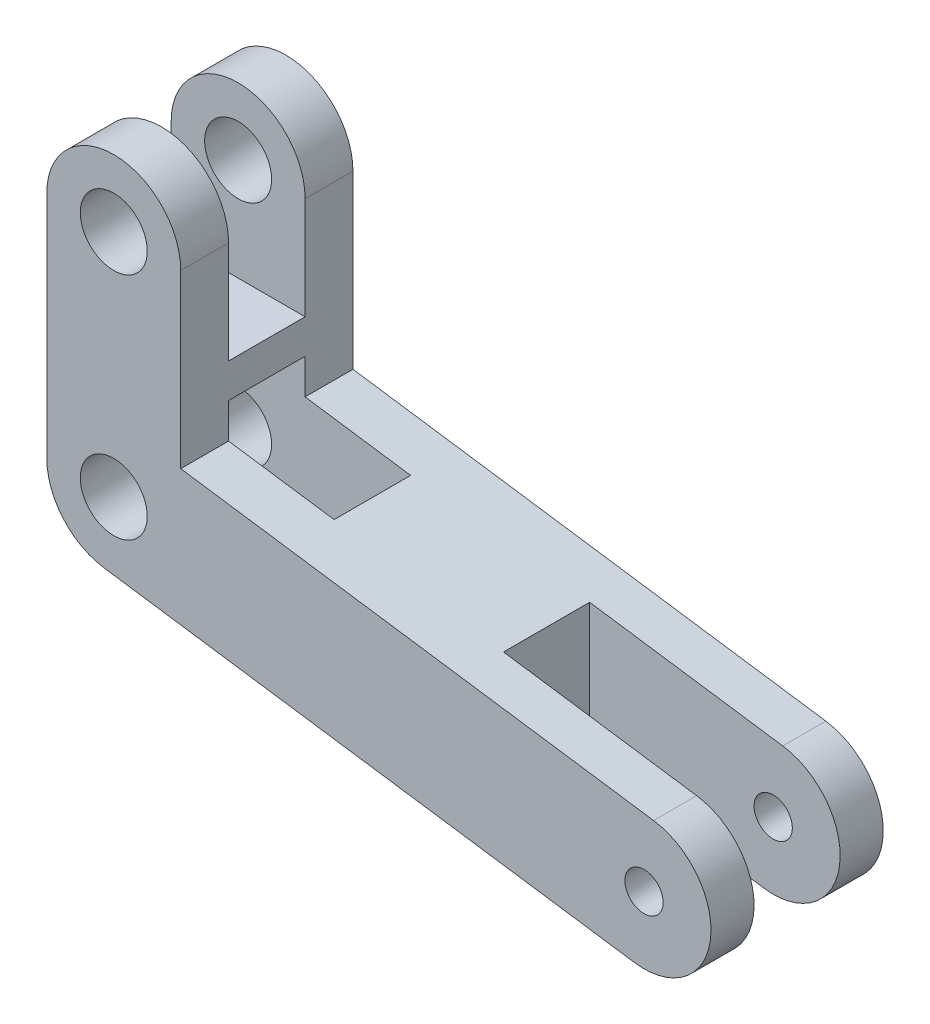
ISO-10303-21;
HEADER;
FILE_DESCRIPTION(('STEP AP214'),'2;1');
FILE_NAME('part.step','',(''),(''),'','','');
FILE_SCHEMA(('AUTOMOTIVE_DESIGN { 1 0 10303 214 1 1 1 1 }'));
ENDSEC;
DATA;
#1=APPLICATION_CONTEXT('core data for automotive mechanical design processes');
#2=APPLICATION_PROTOCOL_DEFINITION('international standard','automotive_design',2000,#1);
#3=PRODUCT_CONTEXT('',#1,'mechanical');
#4=PRODUCT('Part','Part','',(#3));
#5=PRODUCT_RELATED_PRODUCT_CATEGORY('part','',(#4));
#6=PRODUCT_DEFINITION_FORMATION('','',#4);
#7=PRODUCT_DEFINITION_CONTEXT('part definition',#1,'design');
#8=PRODUCT_DEFINITION('design','',#6,#7);
#9=PRODUCT_DEFINITION_SHAPE('','',#8);
#10=(LENGTH_UNIT() NAMED_UNIT(*) SI_UNIT(.MILLI.,.METRE.));
#11=(NAMED_UNIT(*) PLANE_ANGLE_UNIT() SI_UNIT($,.RADIAN.));
#12=(NAMED_UNIT(*) SI_UNIT($,.STERADIAN.) SOLID_ANGLE_UNIT());
#13=UNCERTAINTY_MEASURE_WITH_UNIT(LENGTH_MEASURE(1.E-05),#10,'distance_accuracy_value','');
#14=(GEOMETRIC_REPRESENTATION_CONTEXT(3) GLOBAL_UNCERTAINTY_ASSIGNED_CONTEXT((#13)) GLOBAL_UNIT_ASSIGNED_CONTEXT((#10,
#11,#12)) REPRESENTATION_CONTEXT('',''));
#15=CARTESIAN_POINT('',(0.,0.,0.));
#16=DIRECTION('',(0.,0.,1.));
#17=DIRECTION('',(1.,0.,0.));
#18=AXIS2_PLACEMENT_3D('',#15,#16,#17);
#19=CARTESIAN_POINT('',(27.712812921102,-4.,4.5));
#20=DIRECTION('',(0.,0.,-1.));
#21=DIRECTION('',(-1.,0.,0.));
#22=AXIS2_PLACEMENT_3D('',#19,#20,#21);
#23=CYLINDRICAL_SURFACE('',#22,3.5);
#24=CARTESIAN_POINT('',(27.712812921102,-4.,-2.25));
#25=DIRECTION('',(0.,0.,1.));
#26=DIRECTION('',(1.,0.,0.));
#27=AXIS2_PLACEMENT_3D('',#24,#25,#26);
#28=CIRCLE('',#27,3.5);
#29=CARTESIAN_POINT('',(27.212812921102,-7.46410161513776,-2.25));
#30=VERTEX_POINT('',#29);
#31=CARTESIAN_POINT('',(28.212812921102,-0.535898384862245,-2.25));
#32=VERTEX_POINT('',#31);
#33=EDGE_CURVE('E219',#30,#32,#28,.T.);
#34=ORIENTED_EDGE('',*,*,#33,.F.);
#35=DIRECTION('',(0.,0.,-1.));
#36=VECTOR('',#35,1.);
#37=CARTESIAN_POINT('',(27.212812921102,-7.46410161513776,4.5));
#38=LINE('',#37,#36);
#39=CARTESIAN_POINT('',(27.212812921102,-7.46410161513776,-4.5));
#40=VERTEX_POINT('',#39);
#41=EDGE_CURVE('E323',#30,#40,#38,.T.);
#42=ORIENTED_EDGE('',*,*,#41,.T.);
#43=CARTESIAN_POINT('',(27.712812921102,-4.,-4.5));
#44=DIRECTION('',(0.,0.,1.));
#45=DIRECTION('',(1.,0.,0.));
#46=AXIS2_PLACEMENT_3D('',#43,#44,#45);
#47=CIRCLE('',#46,3.5);
#48=CARTESIAN_POINT('',(28.212812921102,-0.535898384862245,-4.5));
#49=VERTEX_POINT('',#48);
#50=EDGE_CURVE('E304',#40,#49,#47,.T.);
#51=ORIENTED_EDGE('',*,*,#50,.T.);
#52=DIRECTION('',(0.,0.,-1.));
#53=VECTOR('',#52,1.);
#54=CARTESIAN_POINT('',(28.212812921102,-0.535898384862245,4.5));
#55=LINE('',#54,#53);
#56=EDGE_CURVE('E366',#32,#49,#55,.T.);
#57=ORIENTED_EDGE('',*,*,#56,.F.);
#58=EDGE_LOOP('',(#34,#42,#51,#57));
#59=FACE_BOUND('',#58,.T.);
#60=ADVANCED_FACE('F41',(#59),#23,.T.);
#61=CARTESIAN_POINT('',(28.212812921102,-0.535898384862245,4.5));
#62=DIRECTION('',(-0.142857142857143,-0.989743318610787,0.));
#63=DIRECTION('',(0.989743318610787,-0.142857142857143,0.));
#64=AXIS2_PLACEMENT_3D('',#61,#62,#63);
#65=PLANE('',#64);
#66=DIRECTION('',(-0.989743318610787,0.142857142857143,0.));
#67=VECTOR('',#66,1.);
#68=CARTESIAN_POINT('',(28.212812921102,-0.535898384862245,-2.25));
#69=LINE('',#68,#67);
#70=CARTESIAN_POINT('',(18.1194036640366,0.920959753039698,-2.25));
#71=VERTEX_POINT('',#70);
#72=EDGE_CURVE('E201',#32,#71,#69,.T.);
#73=ORIENTED_EDGE('',*,*,#72,.F.);
#74=ORIENTED_EDGE('',*,*,#56,.T.);
#75=DIRECTION('',(-0.989743318610787,0.142857142857143,0.));
#76=VECTOR('',#75,1.);
#77=CARTESIAN_POINT('',(28.212812921102,-0.535898384862245,-4.5));
#78=LINE('',#77,#76);
#79=CARTESIAN_POINT('',(3.5,3.03108891324554,-4.5));
#80=VERTEX_POINT('',#79);
#81=EDGE_CURVE('E326',#49,#80,#78,.T.);
#82=ORIENTED_EDGE('',*,*,#81,.T.);
#83=DIRECTION('',(0.,0.,-1.));
#84=VECTOR('',#83,1.);
#85=CARTESIAN_POINT('',(3.5,3.03108891324554,4.5));
#86=LINE('',#85,#84);
#87=CARTESIAN_POINT('',(3.5,3.03108891324554,-2.));
#88=VERTEX_POINT('',#87);
#89=EDGE_CURVE('E362',#88,#80,#86,.T.);
#90=ORIENTED_EDGE('',*,*,#89,.F.);
#91=DIRECTION('',(0.989743318610787,-0.142857142857143,0.));
#92=VECTOR('',#91,1.);
#93=CARTESIAN_POINT('',(28.212812921102,-0.535898384862245,-2.));
#94=LINE('',#93,#92);
#95=CARTESIAN_POINT('',(9.01483292771079,2.23509134440813,-2.));
#96=VERTEX_POINT('',#95);
#97=EDGE_CURVE('E279',#88,#96,#94,.T.);
#98=ORIENTED_EDGE('',*,*,#97,.T.);
#99=DIRECTION('',(0.,0.,1.));
#100=VECTOR('',#99,1.);
#101=CARTESIAN_POINT('',(9.01483292771079,2.23509134440813,4.5));
#102=LINE('',#101,#100);
#103=CARTESIAN_POINT('',(9.01483292771079,2.23509134440813,2.));
#104=VERTEX_POINT('',#103);
#105=EDGE_CURVE('E282',#96,#104,#102,.T.);
#106=ORIENTED_EDGE('',*,*,#105,.T.);
#107=DIRECTION('',(0.989743318610787,-0.142857142857143,0.));
#108=VECTOR('',#107,1.);
#109=CARTESIAN_POINT('',(28.212812921102,-0.535898384862245,2.));
#110=LINE('',#109,#108);
#111=CARTESIAN_POINT('',(3.5,3.03108891324554,2.));
#112=VERTEX_POINT('',#111);
#113=EDGE_CURVE('E264',#112,#104,#110,.T.);
#114=ORIENTED_EDGE('',*,*,#113,.F.);
#115=CARTESIAN_POINT('',(3.5,3.03108891324554,4.5));
#116=VERTEX_POINT('',#115);
#117=EDGE_CURVE('E363',#116,#112,#86,.T.);
#118=ORIENTED_EDGE('',*,*,#117,.F.);
#119=DIRECTION('',(-0.989743318610787,0.142857142857143,0.));
#120=VECTOR('',#119,1.);
#121=CARTESIAN_POINT('',(28.212812921102,-0.535898384862245,4.5));
#122=LINE('',#121,#120);
#123=CARTESIAN_POINT('',(28.212812921102,-0.535898384862245,4.5));
#124=VERTEX_POINT('',#123);
#125=EDGE_CURVE('E310',#124,#116,#122,.T.);
#126=ORIENTED_EDGE('',*,*,#125,.F.);
#127=CARTESIAN_POINT('',(28.212812921102,-0.535898384862245,2.25));
#128=VERTEX_POINT('',#127);
#129=EDGE_CURVE('E210',#124,#128,#55,.T.);
#130=ORIENTED_EDGE('',*,*,#129,.T.);
#131=DIRECTION('',(-0.989743318610787,0.142857142857143,0.));
#132=VECTOR('',#131,1.);
#133=CARTESIAN_POINT('',(28.212812921102,-0.535898384862245,2.25));
#134=LINE('',#133,#132);
#135=CARTESIAN_POINT('',(18.1194036640366,0.920959753039698,2.25));
#136=VERTEX_POINT('',#135);
#137=EDGE_CURVE('E204',#128,#136,#134,.T.);
#138=ORIENTED_EDGE('',*,*,#137,.T.);
#139=DIRECTION('',(0.,0.,-1.));
#140=VECTOR('',#139,1.);
#141=CARTESIAN_POINT('',(18.1194036640366,0.920959753039699,4.5));
#142=LINE('',#141,#140);
#143=EDGE_CURVE('E191',#136,#71,#142,.T.);
#144=ORIENTED_EDGE('',*,*,#143,.T.);
#145=EDGE_LOOP('',(#73,#74,#82,#90,#98,#106,#114,#118,#126,#130,#138,#144));
#146=FACE_BOUND('',#145,.T.);
#147=ADVANCED_FACE('F208',(#146),#65,.F.);
#148=CARTESIAN_POINT('',(27.212812921102,-7.46410161513776,4.5));
#149=DIRECTION('',(0.142857142857143,0.989743318610787,0.));
#150=DIRECTION('',(-0.989743318610787,0.142857142857143,0.));
#151=AXIS2_PLACEMENT_3D('',#148,#149,#150);
#152=PLANE('',#151);
#153=DIRECTION('',(0.989743318610787,-0.142857142857143,0.));
#154=VECTOR('',#153,1.);
#155=CARTESIAN_POINT('',(27.212812921102,-7.46410161513776,-2.25));
#156=LINE('',#155,#154);
#157=CARTESIAN_POINT('',(18.1194036640366,-6.15158104453322,-2.25));
#158=VERTEX_POINT('',#157);
#159=EDGE_CURVE('E214',#158,#30,#156,.T.);
#160=ORIENTED_EDGE('',*,*,#159,.F.);
#161=DIRECTION('',(0.,0.,1.));
#162=VECTOR('',#161,1.);
#163=CARTESIAN_POINT('',(18.1194036640366,-6.15158104453322,4.5));
#164=LINE('',#163,#162);
#165=CARTESIAN_POINT('',(18.1194036640366,-6.15158104453322,2.25));
#166=VERTEX_POINT('',#165);
#167=EDGE_CURVE('E11',#158,#166,#164,.T.);
#168=ORIENTED_EDGE('',*,*,#167,.T.);
#169=DIRECTION('',(0.989743318610787,-0.142857142857143,0.));
#170=VECTOR('',#169,1.);
#171=CARTESIAN_POINT('',(27.212812921102,-7.46410161513776,2.25));
#172=LINE('',#171,#170);
#173=CARTESIAN_POINT('',(27.212812921102,-7.46410161513776,2.25));
#174=VERTEX_POINT('',#173);
#175=EDGE_CURVE('E205',#166,#174,#172,.T.);
#176=ORIENTED_EDGE('',*,*,#175,.T.);
#177=CARTESIAN_POINT('',(27.212812921102,-7.46410161513776,4.5));
#178=VERTEX_POINT('',#177);
#179=EDGE_CURVE('E343',#178,#174,#38,.T.);
#180=ORIENTED_EDGE('',*,*,#179,.F.);
#181=DIRECTION('',(0.989743318610787,-0.142857142857143,0.));
#182=VECTOR('',#181,1.);
#183=CARTESIAN_POINT('',(27.212812921102,-7.46410161513776,4.5));
#184=LINE('',#183,#182);
#185=CARTESIAN_POINT('',(-0.5,-3.46410161513775,4.5));
#186=VERTEX_POINT('',#185);
#187=EDGE_CURVE('E321',#186,#178,#184,.T.);
#188=ORIENTED_EDGE('',*,*,#187,.F.);
#189=DIRECTION('',(0.,0.,-1.));
#190=VECTOR('',#189,1.);
#191=CARTESIAN_POINT('',(-0.5,-3.46410161513775,4.5));
#192=LINE('',#191,#190);
#193=CARTESIAN_POINT('',(-0.5,-3.46410161513775,2.));
#194=VERTEX_POINT('',#193);
#195=EDGE_CURVE('E347',#186,#194,#192,.T.);
#196=ORIENTED_EDGE('',*,*,#195,.T.);
#197=DIRECTION('',(-0.989743318610787,0.142857142857143,0.));
#198=VECTOR('',#197,1.);
#199=CARTESIAN_POINT('',(27.212812921102,-7.46410161513776,2.));
#200=LINE('',#199,#198);
#201=CARTESIAN_POINT('',(9.01483292771079,-4.83744945316479,2.));
#202=VERTEX_POINT('',#201);
#203=EDGE_CURVE('E256',#202,#194,#200,.T.);
#204=ORIENTED_EDGE('',*,*,#203,.F.);
#205=DIRECTION('',(0.,0.,-1.));
#206=VECTOR('',#205,1.);
#207=CARTESIAN_POINT('',(9.01483292771079,-4.83744945316479,4.5));
#208=LINE('',#207,#206);
#209=CARTESIAN_POINT('',(9.01483292771079,-4.83744945316479,-2.));
#210=VERTEX_POINT('',#209);
#211=EDGE_CURVE('E368',#202,#210,#208,.T.);
#212=ORIENTED_EDGE('',*,*,#211,.T.);
#213=DIRECTION('',(-0.989743318610787,0.142857142857143,0.));
#214=VECTOR('',#213,1.);
#215=CARTESIAN_POINT('',(27.212812921102,-7.46410161513776,-2.));
#216=LINE('',#215,#214);
#217=CARTESIAN_POINT('',(-0.5,-3.46410161513775,-2.));
#218=VERTEX_POINT('',#217);
#219=EDGE_CURVE('E267',#210,#218,#216,.T.);
#220=ORIENTED_EDGE('',*,*,#219,.T.);
#221=CARTESIAN_POINT('',(-0.5,-3.46410161513775,-4.5));
#222=VERTEX_POINT('',#221);
#223=EDGE_CURVE('E346',#218,#222,#192,.T.);
#224=ORIENTED_EDGE('',*,*,#223,.T.);
#225=DIRECTION('',(0.989743318610787,-0.142857142857143,0.));
#226=VECTOR('',#225,1.);
#227=CARTESIAN_POINT('',(27.212812921102,-7.46410161513776,-4.5));
#228=LINE('',#227,#226);
#229=EDGE_CURVE('E311',#222,#40,#228,.T.);
#230=ORIENTED_EDGE('',*,*,#229,.T.);
#231=ORIENTED_EDGE('',*,*,#41,.F.);
#232=EDGE_LOOP('',(#160,#168,#176,#180,#188,#196,#204,#212,#220,#224,#230,#231));
#233=FACE_BOUND('',#232,.T.);
#234=ADVANCED_FACE('F395',(#233),#152,.F.);
#235=CARTESIAN_POINT('',(27.712812921102,-4.,4.5));
#236=DIRECTION('',(0.,0.,-1.));
#237=DIRECTION('',(-1.,0.,0.));
#238=AXIS2_PLACEMENT_3D('',#235,#236,#237);
#239=CYLINDRICAL_SURFACE('',#238,0.999999999999998);
#240=CARTESIAN_POINT('',(27.712812921102,-4.,-4.5));
#241=DIRECTION('',(0.,0.,1.));
#242=DIRECTION('',(1.,0.,0.));
#243=AXIS2_PLACEMENT_3D('',#240,#241,#242);
#244=CIRCLE('',#243,0.999999999999998);
#245=CARTESIAN_POINT('',(28.712812921102,-4.,-4.5));
#246=VERTEX_POINT('',#245);
#247=EDGE_CURVE('E292',#246,#246,#244,.T.);
#248=ORIENTED_EDGE('',*,*,#247,.F.);
#249=EDGE_LOOP('',(#248));
#250=FACE_BOUND('',#249,.T.);
#251=CARTESIAN_POINT('',(27.712812921102,-4.,-2.25));
#252=DIRECTION('',(0.,0.,1.));
#253=DIRECTION('',(1.,0.,0.));
#254=AXIS2_PLACEMENT_3D('',#251,#252,#253);
#255=CIRCLE('',#254,0.999999999999998);
#256=CARTESIAN_POINT('',(28.712812921102,-4.,-2.25));
#257=VERTEX_POINT('',#256);
#258=EDGE_CURVE('E211',#257,#257,#255,.T.);
#259=ORIENTED_EDGE('',*,*,#258,.T.);
#260=EDGE_LOOP('',(#259));
#261=FACE_BOUND('',#260,.T.);
#262=ADVANCED_FACE('F470',(#250,#261),#239,.F.);
#263=CARTESIAN_POINT('',(3.5,12.,4.5));
#264=DIRECTION('',(-1.,0.,0.));
#265=DIRECTION('',(0.,-1.,0.));
#266=AXIS2_PLACEMENT_3D('',#263,#264,#265);
#267=PLANE('',#266);
#268=DIRECTION('',(0.,1.,0.));
#269=VECTOR('',#268,1.);
#270=CARTESIAN_POINT('',(3.5,16.4698635435501,-2.));
#271=LINE('',#270,#269);
#272=CARTESIAN_POINT('',(3.5,6.65669603838257,-2.));
#273=VERTEX_POINT('',#272);
#274=CARTESIAN_POINT('',(3.5,12.,-2.));
#275=VERTEX_POINT('',#274);
#276=EDGE_CURVE('E224',#273,#275,#271,.T.);
#277=ORIENTED_EDGE('',*,*,#276,.F.);
#278=DIRECTION('',(0.,0.,1.));
#279=VECTOR('',#278,1.);
#280=CARTESIAN_POINT('',(3.5,6.65669603838257,-2.));
#281=LINE('',#280,#279);
#282=CARTESIAN_POINT('',(3.5,6.65669603838257,2.));
#283=VERTEX_POINT('',#282);
#284=EDGE_CURVE('E227',#273,#283,#281,.T.);
#285=ORIENTED_EDGE('',*,*,#284,.T.);
#286=DIRECTION('',(0.,1.,0.));
#287=VECTOR('',#286,1.);
#288=CARTESIAN_POINT('',(3.5,16.4698635435501,2.));
#289=LINE('',#288,#287);
#290=CARTESIAN_POINT('',(3.5,12.,2.));
#291=VERTEX_POINT('',#290);
#292=EDGE_CURVE('E225',#283,#291,#289,.T.);
#293=ORIENTED_EDGE('',*,*,#292,.T.);
#294=DIRECTION('',(0.,0.,-1.));
#295=VECTOR('',#294,1.);
#296=CARTESIAN_POINT('',(3.5,12.,4.5));
#297=LINE('',#296,#295);
#298=CARTESIAN_POINT('',(3.5,12.,4.5));
#299=VERTEX_POINT('',#298);
#300=EDGE_CURVE('E359',#299,#291,#297,.T.);
#301=ORIENTED_EDGE('',*,*,#300,.F.);
#302=DIRECTION('',(0.,1.,0.));
#303=VECTOR('',#302,1.);
#304=CARTESIAN_POINT('',(3.5,12.,4.5));
#305=LINE('',#304,#303);
#306=EDGE_CURVE('E313',#116,#299,#305,.T.);
#307=ORIENTED_EDGE('',*,*,#306,.F.);
#308=ORIENTED_EDGE('',*,*,#117,.T.);
#309=DIRECTION('',(0.,-1.,0.));
#310=VECTOR('',#309,1.);
#311=CARTESIAN_POINT('',(3.5,12.,2.));
#312=LINE('',#311,#310);
#313=CARTESIAN_POINT('',(3.5,4.86934920884361,2.));
#314=VERTEX_POINT('',#313);
#315=EDGE_CURVE('E262',#314,#112,#312,.T.);
#316=ORIENTED_EDGE('',*,*,#315,.F.);
#317=DIRECTION('',(0.,0.,-1.));
#318=VECTOR('',#317,1.);
#319=CARTESIAN_POINT('',(3.5,4.86934920884361,4.5));
#320=LINE('',#319,#318);
#321=CARTESIAN_POINT('',(3.5,4.86934920884361,-2.));
#322=VERTEX_POINT('',#321);
#323=EDGE_CURVE('E285',#314,#322,#320,.T.);
#324=ORIENTED_EDGE('',*,*,#323,.T.);
#325=DIRECTION('',(0.,-1.,0.));
#326=VECTOR('',#325,1.);
#327=CARTESIAN_POINT('',(3.5,12.,-2.));
#328=LINE('',#327,#326);
#329=EDGE_CURVE('E276',#322,#88,#328,.T.);
#330=ORIENTED_EDGE('',*,*,#329,.T.);
#331=ORIENTED_EDGE('',*,*,#89,.T.);
#332=DIRECTION('',(0.,1.,0.));
#333=VECTOR('',#332,1.);
#334=CARTESIAN_POINT('',(3.5,12.,-4.5));
#335=LINE('',#334,#333);
#336=CARTESIAN_POINT('',(3.5,12.,-4.5));
#337=VERTEX_POINT('',#336);
#338=EDGE_CURVE('E329',#80,#337,#335,.T.);
#339=ORIENTED_EDGE('',*,*,#338,.T.);
#340=EDGE_CURVE('E358',#275,#337,#297,.T.);
#341=ORIENTED_EDGE('',*,*,#340,.F.);
#342=EDGE_LOOP('',(#277,#285,#293,#301,#307,#308,#316,#324,#330,#331,#339,#341));
#343=FACE_BOUND('',#342,.T.);
#344=ADVANCED_FACE('F411',(#343),#267,.F.);
#345=CARTESIAN_POINT('',(0.,12.,4.5));
#346=DIRECTION('',(0.,0.,-1.));
#347=DIRECTION('',(-1.,0.,0.));
#348=AXIS2_PLACEMENT_3D('',#345,#346,#347);
#349=CYLINDRICAL_SURFACE('',#348,3.5);
#350=CARTESIAN_POINT('',(0.,12.,-2.));
#351=DIRECTION('',(0.,0.,1.));
#352=DIRECTION('',(1.,0.,0.));
#353=AXIS2_PLACEMENT_3D('',#350,#351,#352);
#354=CIRCLE('',#353,3.5);
#355=CARTESIAN_POINT('',(-3.5,12.,-2.));
#356=VERTEX_POINT('',#355);
#357=EDGE_CURVE('E253',#275,#356,#354,.T.);
#358=ORIENTED_EDGE('',*,*,#357,.F.);
#359=ORIENTED_EDGE('',*,*,#340,.T.);
#360=CARTESIAN_POINT('',(0.,12.,-4.5));
#361=DIRECTION('',(0.,0.,1.));
#362=DIRECTION('',(1.,0.,0.));
#363=AXIS2_PLACEMENT_3D('',#360,#361,#362);
#364=CIRCLE('',#363,3.5);
#365=CARTESIAN_POINT('',(-3.5,12.,-4.5));
#366=VERTEX_POINT('',#365);
#367=EDGE_CURVE('E332',#337,#366,#364,.T.);
#368=ORIENTED_EDGE('',*,*,#367,.T.);
#369=DIRECTION('',(0.,0.,-1.));
#370=VECTOR('',#369,1.);
#371=CARTESIAN_POINT('',(-3.5,12.,4.5));
#372=LINE('',#371,#370);
#373=EDGE_CURVE('E354',#356,#366,#372,.T.);
#374=ORIENTED_EDGE('',*,*,#373,.F.);
#375=EDGE_LOOP('',(#358,#359,#368,#374));
#376=FACE_BOUND('',#375,.T.);
#377=ADVANCED_FACE('F459',(#376),#349,.T.);
#378=CARTESIAN_POINT('',(-3.5,12.,4.5));
#379=DIRECTION('',(1.,0.,0.));
#380=DIRECTION('',(0.,1.,0.));
#381=AXIS2_PLACEMENT_3D('',#378,#379,#380);
#382=PLANE('',#381);
#383=DIRECTION('',(0.,-1.,0.));
#384=VECTOR('',#383,1.);
#385=CARTESIAN_POINT('',(-3.5,12.,-2.));
#386=LINE('',#385,#384);
#387=CARTESIAN_POINT('',(-3.5,6.65669603838257,-2.));
#388=VERTEX_POINT('',#387);
#389=EDGE_CURVE('E251',#356,#388,#386,.T.);
#390=ORIENTED_EDGE('',*,*,#389,.F.);
#391=ORIENTED_EDGE('',*,*,#373,.T.);
#392=DIRECTION('',(0.,-1.,0.));
#393=VECTOR('',#392,1.);
#394=CARTESIAN_POINT('',(-3.5,12.,-4.5));
#395=LINE('',#394,#393);
#396=CARTESIAN_POINT('',(-3.5,0.,-4.5));
#397=VERTEX_POINT('',#396);
#398=EDGE_CURVE('E335',#366,#397,#395,.T.);
#399=ORIENTED_EDGE('',*,*,#398,.T.);
#400=DIRECTION('',(0.,0.,-1.));
#401=VECTOR('',#400,1.);
#402=CARTESIAN_POINT('',(-3.5,0.,4.5));
#403=LINE('',#402,#401);
#404=CARTESIAN_POINT('',(-3.5,0.,-2.));
#405=VERTEX_POINT('',#404);
#406=EDGE_CURVE('E350',#405,#397,#403,.T.);
#407=ORIENTED_EDGE('',*,*,#406,.F.);
#408=DIRECTION('',(0.,1.,0.));
#409=VECTOR('',#408,1.);
#410=CARTESIAN_POINT('',(-3.5,12.,-2.));
#411=LINE('',#410,#409);
#412=CARTESIAN_POINT('',(-3.5,4.86934920884361,-2.));
#413=VERTEX_POINT('',#412);
#414=EDGE_CURVE('E273',#405,#413,#411,.T.);
#415=ORIENTED_EDGE('',*,*,#414,.T.);
#416=DIRECTION('',(0.,0.,1.));
#417=VECTOR('',#416,1.);
#418=CARTESIAN_POINT('',(-3.5,4.86934920884361,4.5));
#419=LINE('',#418,#417);
#420=CARTESIAN_POINT('',(-3.5,4.86934920884361,2.));
#421=VERTEX_POINT('',#420);
#422=EDGE_CURVE('E379',#413,#421,#419,.T.);
#423=ORIENTED_EDGE('',*,*,#422,.T.);
#424=DIRECTION('',(0.,1.,0.));
#425=VECTOR('',#424,1.);
#426=CARTESIAN_POINT('',(-3.5,12.,2.));
#427=LINE('',#426,#425);
#428=CARTESIAN_POINT('',(-3.5,0.,2.));
#429=VERTEX_POINT('',#428);
#430=EDGE_CURVE('E260',#429,#421,#427,.T.);
#431=ORIENTED_EDGE('',*,*,#430,.F.);
#432=CARTESIAN_POINT('',(-3.5,0.,4.5));
#433=VERTEX_POINT('',#432);
#434=EDGE_CURVE('E351',#433,#429,#403,.T.);
#435=ORIENTED_EDGE('',*,*,#434,.F.);
#436=DIRECTION('',(0.,-1.,0.));
#437=VECTOR('',#436,1.);
#438=CARTESIAN_POINT('',(-3.5,12.,4.5));
#439=LINE('',#438,#437);
#440=CARTESIAN_POINT('',(-3.5,12.,4.5));
#441=VERTEX_POINT('',#440);
#442=EDGE_CURVE('E317',#441,#433,#439,.T.);
#443=ORIENTED_EDGE('',*,*,#442,.F.);
#444=CARTESIAN_POINT('',(-3.5,12.,2.));
#445=VERTEX_POINT('',#444);
#446=EDGE_CURVE('E355',#441,#445,#372,.T.);
#447=ORIENTED_EDGE('',*,*,#446,.T.);
#448=DIRECTION('',(0.,-1.,0.));
#449=VECTOR('',#448,1.);
#450=CARTESIAN_POINT('',(-3.5,12.,2.));
#451=LINE('',#450,#449);
#452=CARTESIAN_POINT('',(-3.5,6.65669603838257,2.));
#453=VERTEX_POINT('',#452);
#454=EDGE_CURVE('E244',#445,#453,#451,.T.);
#455=ORIENTED_EDGE('',*,*,#454,.T.);
#456=DIRECTION('',(0.,0.,-1.));
#457=VECTOR('',#456,1.);
#458=CARTESIAN_POINT('',(-3.5,6.65669603838257,4.5));
#459=LINE('',#458,#457);
#460=EDGE_CURVE('E49',#453,#388,#459,.T.);
#461=ORIENTED_EDGE('',*,*,#460,.T.);
#462=EDGE_LOOP('',(#390,#391,#399,#407,#415,#423,#431,#435,#443,#447,#455,#461));
#463=FACE_BOUND('',#462,.T.);
#464=ADVANCED_FACE('F434',(#463),#382,.F.);
#465=CARTESIAN_POINT('',(0.,0.,4.5));
#466=DIRECTION('',(0.,0.,-1.));
#467=DIRECTION('',(-1.,0.,0.));
#468=AXIS2_PLACEMENT_3D('',#465,#466,#467);
#469=CYLINDRICAL_SURFACE('',#468,3.5);
#470=CARTESIAN_POINT('',(0.,0.,2.));
#471=DIRECTION('',(0.,0.,-1.));
#472=DIRECTION('',(-1.,0.,0.));
#473=AXIS2_PLACEMENT_3D('',#470,#471,#472);
#474=CIRCLE('',#473,3.5);
#475=EDGE_CURVE('E258',#194,#429,#474,.T.);
#476=ORIENTED_EDGE('',*,*,#475,.F.);
#477=ORIENTED_EDGE('',*,*,#195,.F.);
#478=CARTESIAN_POINT('',(0.,0.,4.5));
#479=DIRECTION('',(0.,0.,1.));
#480=DIRECTION('',(1.,0.,0.));
#481=AXIS2_PLACEMENT_3D('',#478,#479,#480);
#482=CIRCLE('',#481,3.5);
#483=EDGE_CURVE('E319',#433,#186,#482,.T.);
#484=ORIENTED_EDGE('',*,*,#483,.F.);
#485=ORIENTED_EDGE('',*,*,#434,.T.);
#486=EDGE_LOOP('',(#476,#477,#484,#485));
#487=FACE_BOUND('',#486,.T.);
#488=ADVANCED_FACE('F428',(#487),#469,.T.);
#489=CARTESIAN_POINT('',(0.,0.,4.5));
#490=DIRECTION('',(0.,0.,-1.));
#491=DIRECTION('',(-1.,0.,0.));
#492=AXIS2_PLACEMENT_3D('',#489,#490,#491);
#493=CYLINDRICAL_SURFACE('',#492,1.75);
#494=CARTESIAN_POINT('',(0.,0.,4.5));
#495=DIRECTION('',(0.,0.,1.));
#496=DIRECTION('',(1.,0.,0.));
#497=AXIS2_PLACEMENT_3D('',#494,#495,#496);
#498=CIRCLE('',#497,1.75);
#499=CARTESIAN_POINT('',(1.75,0.,4.5));
#500=VERTEX_POINT('',#499);
#501=EDGE_CURVE('E301',#500,#500,#498,.T.);
#502=ORIENTED_EDGE('',*,*,#501,.T.);
#503=EDGE_LOOP('',(#502));
#504=FACE_BOUND('',#503,.T.);
#505=CARTESIAN_POINT('',(0.,0.,2.));
#506=DIRECTION('',(0.,0.,-1.));
#507=DIRECTION('',(-1.,0.,0.));
#508=AXIS2_PLACEMENT_3D('',#505,#506,#507);
#509=CIRCLE('',#508,1.75);
#510=CARTESIAN_POINT('',(-1.75,0.,2.));
#511=VERTEX_POINT('',#510);
#512=EDGE_CURVE('E255',#511,#511,#509,.T.);
#513=ORIENTED_EDGE('',*,*,#512,.T.);
#514=EDGE_LOOP('',(#513));
#515=FACE_BOUND('',#514,.T.);
#516=ADVANCED_FACE('F489',(#504,#515),#493,.F.);
#517=CARTESIAN_POINT('',(0.,12.,4.5));
#518=DIRECTION('',(0.,0.,-1.));
#519=DIRECTION('',(-1.,0.,0.));
#520=AXIS2_PLACEMENT_3D('',#517,#518,#519);
#521=CYLINDRICAL_SURFACE('',#520,1.75);
#522=CARTESIAN_POINT('',(0.,12.,-4.5));
#523=DIRECTION('',(0.,0.,1.));
#524=DIRECTION('',(1.,0.,0.));
#525=AXIS2_PLACEMENT_3D('',#522,#523,#524);
#526=CIRCLE('',#525,1.75);
#527=CARTESIAN_POINT('',(1.75,12.,-4.5));
#528=VERTEX_POINT('',#527);
#529=EDGE_CURVE('E288',#528,#528,#526,.T.);
#530=ORIENTED_EDGE('',*,*,#529,.F.);
#531=EDGE_LOOP('',(#530));
#532=FACE_BOUND('',#531,.T.);
#533=CARTESIAN_POINT('',(0.,12.,-2.));
#534=DIRECTION('',(0.,0.,1.));
#535=DIRECTION('',(1.,0.,0.));
#536=AXIS2_PLACEMENT_3D('',#533,#534,#535);
#537=CIRCLE('',#536,1.75);
#538=CARTESIAN_POINT('',(1.75,12.,-2.));
#539=VERTEX_POINT('',#538);
#540=EDGE_CURVE('E250',#539,#539,#537,.T.);
#541=ORIENTED_EDGE('',*,*,#540,.T.);
#542=EDGE_LOOP('',(#541));
#543=FACE_BOUND('',#542,.T.);
#544=ADVANCED_FACE('F483',(#532,#543),#521,.F.);
#545=CARTESIAN_POINT('',(27.712812921102,-4.,4.5));
#546=DIRECTION('',(0.,0.,1.));
#547=DIRECTION('',(1.,0.,0.));
#548=AXIS2_PLACEMENT_3D('',#545,#546,#547);
#549=PLANE('',#548);
#550=CARTESIAN_POINT('',(27.712812921102,-4.,4.5));
#551=DIRECTION('',(0.,0.,1.));
#552=DIRECTION('',(1.,0.,0.));
#553=AXIS2_PLACEMENT_3D('',#550,#551,#552);
#554=CIRCLE('',#553,0.999999999999998);
#555=CARTESIAN_POINT('',(28.712812921102,-4.,4.5));
#556=VERTEX_POINT('',#555);
#557=EDGE_CURVE('E295',#556,#556,#554,.T.);
#558=ORIENTED_EDGE('',*,*,#557,.F.);
#559=EDGE_LOOP('',(#558));
#560=FACE_BOUND('',#559,.T.);
#561=CARTESIAN_POINT('',(27.712812921102,-4.,4.5));
#562=DIRECTION('',(0.,0.,1.));
#563=DIRECTION('',(1.,0.,0.));
#564=AXIS2_PLACEMENT_3D('',#561,#562,#563);
#565=CIRCLE('',#564,3.5);
#566=EDGE_CURVE('E307',#178,#124,#565,.T.);
#567=ORIENTED_EDGE('',*,*,#566,.T.);
#568=ORIENTED_EDGE('',*,*,#125,.T.);
#569=ORIENTED_EDGE('',*,*,#306,.T.);
#570=CARTESIAN_POINT('',(0.,12.,4.5));
#571=DIRECTION('',(0.,0.,1.));
#572=DIRECTION('',(1.,0.,0.));
#573=AXIS2_PLACEMENT_3D('',#570,#571,#572);
#574=CIRCLE('',#573,3.5);
#575=EDGE_CURVE('E315',#299,#441,#574,.T.);
#576=ORIENTED_EDGE('',*,*,#575,.T.);
#577=ORIENTED_EDGE('',*,*,#442,.T.);
#578=ORIENTED_EDGE('',*,*,#483,.T.);
#579=ORIENTED_EDGE('',*,*,#187,.T.);
#580=EDGE_LOOP('',(#567,#568,#569,#576,#577,#578,#579));
#581=FACE_BOUND('',#580,.T.);
#582=ORIENTED_EDGE('',*,*,#501,.F.);
#583=EDGE_LOOP('',(#582));
#584=FACE_BOUND('',#583,.T.);
#585=CARTESIAN_POINT('',(0.,12.,4.5));
#586=DIRECTION('',(0.,0.,1.));
#587=DIRECTION('',(1.,0.,0.));
#588=AXIS2_PLACEMENT_3D('',#585,#586,#587);
#589=CIRCLE('',#588,1.75);
#590=CARTESIAN_POINT('',(1.75,12.,4.5));
#591=VERTEX_POINT('',#590);
#592=EDGE_CURVE('E289',#591,#591,#589,.T.);
#593=ORIENTED_EDGE('',*,*,#592,.F.);
#594=EDGE_LOOP('',(#593));
#595=FACE_BOUND('',#594,.T.);
#596=ADVANCED_FACE('F443',(#560,#581,#584,#595),#549,.T.);
#597=CARTESIAN_POINT('',(27.712812921102,-4.,-4.5));
#598=DIRECTION('',(0.,0.,1.));
#599=DIRECTION('',(1.,0.,0.));
#600=AXIS2_PLACEMENT_3D('',#597,#598,#599);
#601=PLANE('',#600);
#602=ORIENTED_EDGE('',*,*,#50,.F.);
#603=ORIENTED_EDGE('',*,*,#229,.F.);
#604=CARTESIAN_POINT('',(0.,0.,-4.5));
#605=DIRECTION('',(0.,0.,1.));
#606=DIRECTION('',(1.,0.,0.));
#607=AXIS2_PLACEMENT_3D('',#604,#605,#606);
#608=CIRCLE('',#607,3.5);
#609=EDGE_CURVE('E338',#397,#222,#608,.T.);
#610=ORIENTED_EDGE('',*,*,#609,.F.);
#611=ORIENTED_EDGE('',*,*,#398,.F.);
#612=ORIENTED_EDGE('',*,*,#367,.F.);
#613=ORIENTED_EDGE('',*,*,#338,.F.);
#614=ORIENTED_EDGE('',*,*,#81,.F.);
#615=EDGE_LOOP('',(#602,#603,#610,#611,#612,#613,#614));
#616=FACE_BOUND('',#615,.T.);
#617=CARTESIAN_POINT('',(0.,0.,-4.5));
#618=DIRECTION('',(0.,0.,1.));
#619=DIRECTION('',(1.,0.,0.));
#620=AXIS2_PLACEMENT_3D('',#617,#618,#619);
#621=CIRCLE('',#620,1.75);
#622=CARTESIAN_POINT('',(1.75,0.,-4.5));
#623=VERTEX_POINT('',#622);
#624=EDGE_CURVE('E298',#623,#623,#621,.T.);
#625=ORIENTED_EDGE('',*,*,#624,.T.);
#626=EDGE_LOOP('',(#625));
#627=FACE_BOUND('',#626,.T.);
#628=ORIENTED_EDGE('',*,*,#247,.T.);
#629=EDGE_LOOP('',(#628));
#630=FACE_BOUND('',#629,.T.);
#631=ORIENTED_EDGE('',*,*,#529,.T.);
#632=EDGE_LOOP('',(#631));
#633=FACE_BOUND('',#632,.T.);
#634=ADVANCED_FACE('F404',(#616,#627,#630,#633),#601,.F.);
#635=ORIENTED_EDGE('',*,*,#179,.T.);
#636=CARTESIAN_POINT('',(27.712812921102,-4.,2.25));
#637=DIRECTION('',(0.,0.,1.));
#638=DIRECTION('',(1.,0.,0.));
#639=AXIS2_PLACEMENT_3D('',#636,#637,#638);
#640=CIRCLE('',#639,3.5);
#641=EDGE_CURVE('E56',#174,#128,#640,.T.);
#642=ORIENTED_EDGE('',*,*,#641,.T.);
#643=ORIENTED_EDGE('',*,*,#129,.F.);
#644=ORIENTED_EDGE('',*,*,#566,.F.);
#645=EDGE_LOOP('',(#635,#642,#643,#644));
#646=FACE_BOUND('',#645,.T.);
#647=ADVANCED_FACE('F43',(#646),#23,.T.);
#648=ORIENTED_EDGE('',*,*,#300,.T.);
#649=CARTESIAN_POINT('',(0.,12.,2.));
#650=DIRECTION('',(0.,0.,1.));
#651=DIRECTION('',(1.,0.,0.));
#652=AXIS2_PLACEMENT_3D('',#649,#650,#651);
#653=CIRCLE('',#652,3.5);
#654=EDGE_CURVE('E247',#291,#445,#653,.T.);
#655=ORIENTED_EDGE('',*,*,#654,.T.);
#656=ORIENTED_EDGE('',*,*,#446,.F.);
#657=ORIENTED_EDGE('',*,*,#575,.F.);
#658=EDGE_LOOP('',(#648,#655,#656,#657));
#659=FACE_BOUND('',#658,.T.);
#660=ADVANCED_FACE('F450',(#659),#349,.T.);
#661=ORIENTED_EDGE('',*,*,#223,.F.);
#662=CARTESIAN_POINT('',(0.,0.,-2.));
#663=DIRECTION('',(0.,0.,-1.));
#664=DIRECTION('',(-1.,0.,0.));
#665=AXIS2_PLACEMENT_3D('',#662,#663,#664);
#666=CIRCLE('',#665,3.5);
#667=EDGE_CURVE('E270',#218,#405,#666,.T.);
#668=ORIENTED_EDGE('',*,*,#667,.T.);
#669=ORIENTED_EDGE('',*,*,#406,.T.);
#670=ORIENTED_EDGE('',*,*,#609,.T.);
#671=EDGE_LOOP('',(#661,#668,#669,#670));
#672=FACE_BOUND('',#671,.T.);
#673=ADVANCED_FACE('F456',(#672),#469,.T.);
#674=CARTESIAN_POINT('',(0.,0.,-2.));
#675=DIRECTION('',(0.,0.,-1.));
#676=DIRECTION('',(-1.,0.,0.));
#677=AXIS2_PLACEMENT_3D('',#674,#675,#676);
#678=CIRCLE('',#677,1.75);
#679=CARTESIAN_POINT('',(-1.75,0.,-2.));
#680=VERTEX_POINT('',#679);
#681=EDGE_CURVE('E266',#680,#680,#678,.T.);
#682=ORIENTED_EDGE('',*,*,#681,.F.);
#683=EDGE_LOOP('',(#682));
#684=FACE_BOUND('',#683,.T.);
#685=ORIENTED_EDGE('',*,*,#624,.F.);
#686=EDGE_LOOP('',(#685));
#687=FACE_BOUND('',#686,.T.);
#688=ADVANCED_FACE('F478',(#684,#687),#493,.F.);
#689=CARTESIAN_POINT('',(27.712812921102,-4.,2.25));
#690=DIRECTION('',(0.,0.,1.));
#691=DIRECTION('',(1.,0.,0.));
#692=AXIS2_PLACEMENT_3D('',#689,#690,#691);
#693=CIRCLE('',#692,0.999999999999998);
#694=CARTESIAN_POINT('',(28.712812921102,-4.,2.25));
#695=VERTEX_POINT('',#694);
#696=EDGE_CURVE('E384',#695,#695,#693,.T.);
#697=ORIENTED_EDGE('',*,*,#696,.F.);
#698=EDGE_LOOP('',(#697));
#699=FACE_BOUND('',#698,.T.);
#700=ORIENTED_EDGE('',*,*,#557,.T.);
#701=EDGE_LOOP('',(#700));
#702=FACE_BOUND('',#701,.T.);
#703=ADVANCED_FACE('F487',(#699,#702),#239,.F.);
#704=CARTESIAN_POINT('',(0.,12.,2.));
#705=DIRECTION('',(0.,0.,1.));
#706=DIRECTION('',(1.,0.,0.));
#707=AXIS2_PLACEMENT_3D('',#704,#705,#706);
#708=CIRCLE('',#707,1.75);
#709=CARTESIAN_POINT('',(1.75,12.,2.));
#710=VERTEX_POINT('',#709);
#711=EDGE_CURVE('E235',#710,#710,#708,.T.);
#712=ORIENTED_EDGE('',*,*,#711,.F.);
#713=EDGE_LOOP('',(#712));
#714=FACE_BOUND('',#713,.T.);
#715=ORIENTED_EDGE('',*,*,#592,.T.);
#716=EDGE_LOOP('',(#715));
#717=FACE_BOUND('',#716,.T.);
#718=ADVANCED_FACE('F491',(#714,#717),#521,.F.);
#719=CARTESIAN_POINT('',(-5.69968246198156,6.65669603838257,-2.));
#720=DIRECTION('',(0.,-1.,0.));
#721=DIRECTION('',(0.,0.,-1.));
#722=AXIS2_PLACEMENT_3D('',#719,#720,#721);
#723=PLANE('',#722);
#724=DIRECTION('',(1.,0.,0.));
#725=VECTOR('',#724,1.);
#726=CARTESIAN_POINT('',(-5.69968246198156,6.65669603838257,2.));
#727=LINE('',#726,#725);
#728=EDGE_CURVE('E228',#453,#283,#727,.T.);
#729=ORIENTED_EDGE('',*,*,#728,.T.);
#730=ORIENTED_EDGE('',*,*,#284,.F.);
#731=DIRECTION('',(1.,0.,0.));
#732=VECTOR('',#731,1.);
#733=CARTESIAN_POINT('',(-5.69968246198156,6.65669603838257,-2.));
#734=LINE('',#733,#732);
#735=EDGE_CURVE('E222',#388,#273,#734,.T.);
#736=ORIENTED_EDGE('',*,*,#735,.F.);
#737=ORIENTED_EDGE('',*,*,#460,.F.);
#738=EDGE_LOOP('',(#729,#730,#736,#737));
#739=FACE_BOUND('',#738,.T.);
#740=ADVANCED_FACE('F495',(#739),#723,.F.);
#741=CARTESIAN_POINT('',(0.,0.,-2.));
#742=DIRECTION('',(0.,0.,1.));
#743=DIRECTION('',(1.,0.,0.));
#744=AXIS2_PLACEMENT_3D('',#741,#742,#743);
#745=PLANE('',#744);
#746=ORIENTED_EDGE('',*,*,#540,.F.);
#747=EDGE_LOOP('',(#746));
#748=FACE_BOUND('',#747,.T.);
#749=ORIENTED_EDGE('',*,*,#357,.T.);
#750=ORIENTED_EDGE('',*,*,#389,.T.);
#751=ORIENTED_EDGE('',*,*,#735,.T.);
#752=ORIENTED_EDGE('',*,*,#276,.T.);
#753=EDGE_LOOP('',(#749,#750,#751,#752));
#754=FACE_BOUND('',#753,.T.);
#755=ADVANCED_FACE('F509',(#748,#754),#745,.T.);
#756=CARTESIAN_POINT('',(0.,0.,2.));
#757=DIRECTION('',(0.,0.,1.));
#758=DIRECTION('',(1.,0.,0.));
#759=AXIS2_PLACEMENT_3D('',#756,#757,#758);
#760=PLANE('',#759);
#761=ORIENTED_EDGE('',*,*,#711,.T.);
#762=EDGE_LOOP('',(#761));
#763=FACE_BOUND('',#762,.T.);
#764=ORIENTED_EDGE('',*,*,#292,.F.);
#765=ORIENTED_EDGE('',*,*,#728,.F.);
#766=ORIENTED_EDGE('',*,*,#454,.F.);
#767=ORIENTED_EDGE('',*,*,#654,.F.);
#768=EDGE_LOOP('',(#764,#765,#766,#767));
#769=FACE_BOUND('',#768,.T.);
#770=ADVANCED_FACE('F501',(#763,#769),#760,.F.);
#771=CARTESIAN_POINT('',(-5.64552182951993,4.86934920884361,-2.));
#772=DIRECTION('',(0.,1.,0.));
#773=DIRECTION('',(0.,0.,1.));
#774=AXIS2_PLACEMENT_3D('',#771,#772,#773);
#775=PLANE('',#774);
#776=DIRECTION('',(-1.,0.,0.));
#777=VECTOR('',#776,1.);
#778=CARTESIAN_POINT('',(-5.64552182951993,4.86934920884361,2.));
#779=LINE('',#778,#777);
#780=EDGE_CURVE('E64',#314,#421,#779,.T.);
#781=ORIENTED_EDGE('',*,*,#780,.T.);
#782=ORIENTED_EDGE('',*,*,#422,.F.);
#783=DIRECTION('',(-1.,0.,0.));
#784=VECTOR('',#783,1.);
#785=CARTESIAN_POINT('',(-5.64552182951993,4.86934920884361,-2.));
#786=LINE('',#785,#784);
#787=EDGE_CURVE('E230',#322,#413,#786,.T.);
#788=ORIENTED_EDGE('',*,*,#787,.F.);
#789=ORIENTED_EDGE('',*,*,#323,.F.);
#790=EDGE_LOOP('',(#781,#782,#788,#789));
#791=FACE_BOUND('',#790,.T.);
#792=ADVANCED_FACE('F436',(#791),#775,.F.);
#793=CARTESIAN_POINT('',(9.01483292771079,-5.65610443682518,-2.));
#794=DIRECTION('',(1.,0.,0.));
#795=DIRECTION('',(0.,0.,-1.));
#796=AXIS2_PLACEMENT_3D('',#793,#794,#795);
#797=PLANE('',#796);
#798=DIRECTION('',(0.,1.,0.));
#799=VECTOR('',#798,1.);
#800=CARTESIAN_POINT('',(9.01483292771079,-5.65610443682518,-2.));
#801=LINE('',#800,#799);
#802=EDGE_CURVE('E236',#210,#96,#801,.T.);
#803=ORIENTED_EDGE('',*,*,#802,.F.);
#804=ORIENTED_EDGE('',*,*,#211,.F.);
#805=DIRECTION('',(0.,1.,0.));
#806=VECTOR('',#805,1.);
#807=CARTESIAN_POINT('',(9.01483292771079,-5.65610443682518,2.));
#808=LINE('',#807,#806);
#809=EDGE_CURVE('E200',#202,#104,#808,.T.);
#810=ORIENTED_EDGE('',*,*,#809,.T.);
#811=ORIENTED_EDGE('',*,*,#105,.F.);
#812=EDGE_LOOP('',(#803,#804,#810,#811));
#813=FACE_BOUND('',#812,.T.);
#814=ADVANCED_FACE('F419',(#813),#797,.F.);
#815=CARTESIAN_POINT('',(0.,0.,-2.));
#816=DIRECTION('',(0.,0.,-1.));
#817=DIRECTION('',(-1.,0.,0.));
#818=AXIS2_PLACEMENT_3D('',#815,#816,#817);
#819=PLANE('',#818);
#820=ORIENTED_EDGE('',*,*,#681,.T.);
#821=EDGE_LOOP('',(#820));
#822=FACE_BOUND('',#821,.T.);
#823=ORIENTED_EDGE('',*,*,#329,.F.);
#824=ORIENTED_EDGE('',*,*,#787,.T.);
#825=ORIENTED_EDGE('',*,*,#414,.F.);
#826=ORIENTED_EDGE('',*,*,#667,.F.);
#827=ORIENTED_EDGE('',*,*,#219,.F.);
#828=ORIENTED_EDGE('',*,*,#802,.T.);
#829=ORIENTED_EDGE('',*,*,#97,.F.);
#830=EDGE_LOOP('',(#823,#824,#825,#826,#827,#828,#829));
#831=FACE_BOUND('',#830,.T.);
#832=ADVANCED_FACE('F414',(#822,#831),#819,.F.);
#833=CARTESIAN_POINT('',(0.,0.,2.));
#834=DIRECTION('',(0.,0.,-1.));
#835=DIRECTION('',(-1.,0.,0.));
#836=AXIS2_PLACEMENT_3D('',#833,#834,#835);
#837=PLANE('',#836);
#838=ORIENTED_EDGE('',*,*,#512,.F.);
#839=EDGE_LOOP('',(#838));
#840=FACE_BOUND('',#839,.T.);
#841=ORIENTED_EDGE('',*,*,#113,.T.);
#842=ORIENTED_EDGE('',*,*,#809,.F.);
#843=ORIENTED_EDGE('',*,*,#203,.T.);
#844=ORIENTED_EDGE('',*,*,#475,.T.);
#845=ORIENTED_EDGE('',*,*,#430,.T.);
#846=ORIENTED_EDGE('',*,*,#780,.F.);
#847=ORIENTED_EDGE('',*,*,#315,.T.);
#848=EDGE_LOOP('',(#841,#842,#843,#844,#845,#846,#847));
#849=FACE_BOUND('',#848,.T.);
#850=ADVANCED_FACE('F425',(#840,#849),#837,.T.);
#851=CARTESIAN_POINT('',(18.1194036640366,-10.,-2.25));
#852=DIRECTION('',(-1.,0.,0.));
#853=DIRECTION('',(0.,0.,1.));
#854=AXIS2_PLACEMENT_3D('',#851,#852,#853);
#855=PLANE('',#854);
#856=DIRECTION('',(0.,-1.,0.));
#857=VECTOR('',#856,1.);
#858=CARTESIAN_POINT('',(18.1194036640366,-10.,2.25));
#859=LINE('',#858,#857);
#860=EDGE_CURVE('E194',#136,#166,#859,.T.);
#861=ORIENTED_EDGE('',*,*,#860,.T.);
#862=ORIENTED_EDGE('',*,*,#167,.F.);
#863=DIRECTION('',(0.,-1.,0.));
#864=VECTOR('',#863,1.);
#865=CARTESIAN_POINT('',(18.1194036640366,-10.,-2.25));
#866=LINE('',#865,#864);
#867=EDGE_CURVE('E196',#71,#158,#866,.T.);
#868=ORIENTED_EDGE('',*,*,#867,.F.);
#869=ORIENTED_EDGE('',*,*,#143,.F.);
#870=EDGE_LOOP('',(#861,#862,#868,#869));
#871=FACE_BOUND('',#870,.T.);
#872=ADVANCED_FACE('F193',(#871),#855,.F.);
#873=CARTESIAN_POINT('',(0.,0.,-2.25));
#874=DIRECTION('',(0.,0.,1.));
#875=DIRECTION('',(1.,0.,0.));
#876=AXIS2_PLACEMENT_3D('',#873,#874,#875);
#877=PLANE('',#876);
#878=ORIENTED_EDGE('',*,*,#258,.F.);
#879=EDGE_LOOP('',(#878));
#880=FACE_BOUND('',#879,.T.);
#881=ORIENTED_EDGE('',*,*,#72,.T.);
#882=ORIENTED_EDGE('',*,*,#867,.T.);
#883=ORIENTED_EDGE('',*,*,#159,.T.);
#884=ORIENTED_EDGE('',*,*,#33,.T.);
#885=EDGE_LOOP('',(#881,#882,#883,#884));
#886=FACE_BOUND('',#885,.T.);
#887=ADVANCED_FACE('F391',(#880,#886),#877,.T.);
#888=CARTESIAN_POINT('',(0.,0.,2.25));
#889=DIRECTION('',(0.,0.,1.));
#890=DIRECTION('',(1.,0.,0.));
#891=AXIS2_PLACEMENT_3D('',#888,#889,#890);
#892=PLANE('',#891);
#893=ORIENTED_EDGE('',*,*,#696,.T.);
#894=EDGE_LOOP('',(#893));
#895=FACE_BOUND('',#894,.T.);
#896=ORIENTED_EDGE('',*,*,#641,.F.);
#897=ORIENTED_EDGE('',*,*,#175,.F.);
#898=ORIENTED_EDGE('',*,*,#860,.F.);
#899=ORIENTED_EDGE('',*,*,#137,.F.);
#900=EDGE_LOOP('',(#896,#897,#898,#899));
#901=FACE_BOUND('',#900,.T.);
#902=ADVANCED_FACE('F203',(#895,#901),#892,.F.);
#903=CLOSED_SHELL('',(#60,#147,#234,#262,#344,#377,#464,#488,#516,#544,#596,#634,#647,#660,#673,
#688,#703,#718,#740,#755,#770,#792,#814,#832,#850,#872,#887,#902));
#904=MANIFOLD_SOLID_BREP('B2',#903);
#905=ADVANCED_BREP_SHAPE_REPRESENTATION('',(#18,#904),#14);
#906=SHAPE_DEFINITION_REPRESENTATION(#9,#905);
ENDSEC;
END-ISO-10303-21;
